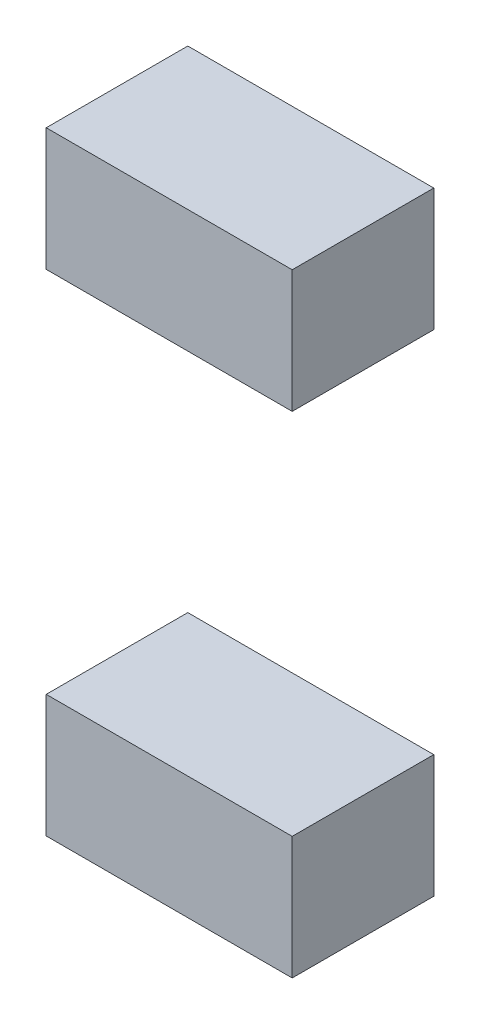
ISO-10303-21;
HEADER;
FILE_DESCRIPTION(('STEP AP214'),'2;1');
FILE_NAME('part.step','',(''),(''),'','','');
FILE_SCHEMA(('AUTOMOTIVE_DESIGN { 1 0 10303 214 1 1 1 1 }'));
ENDSEC;
DATA;
#1=APPLICATION_CONTEXT('core data for automotive mechanical design processes');
#2=APPLICATION_PROTOCOL_DEFINITION('international standard','automotive_design',2000,#1);
#3=PRODUCT_CONTEXT('',#1,'mechanical');
#4=PRODUCT('Part','Part','',(#3));
#5=PRODUCT_RELATED_PRODUCT_CATEGORY('part','',(#4));
#6=PRODUCT_DEFINITION_FORMATION('','',#4);
#7=PRODUCT_DEFINITION_CONTEXT('part definition',#1,'design');
#8=PRODUCT_DEFINITION('design','',#6,#7);
#9=PRODUCT_DEFINITION_SHAPE('','',#8);
#10=(LENGTH_UNIT() NAMED_UNIT(*) SI_UNIT(.MILLI.,.METRE.));
#11=(NAMED_UNIT(*) PLANE_ANGLE_UNIT() SI_UNIT($,.RADIAN.));
#12=(NAMED_UNIT(*) SI_UNIT($,.STERADIAN.) SOLID_ANGLE_UNIT());
#13=UNCERTAINTY_MEASURE_WITH_UNIT(LENGTH_MEASURE(1.E-05),#10,'distance_accuracy_value','');
#14=(GEOMETRIC_REPRESENTATION_CONTEXT(3) GLOBAL_UNCERTAINTY_ASSIGNED_CONTEXT((#13)) GLOBAL_UNIT_ASSIGNED_CONTEXT((#10,
#11,#12)) REPRESENTATION_CONTEXT('',''));
#15=CARTESIAN_POINT('',(0.,0.,0.));
#16=DIRECTION('',(0.,0.,1.));
#17=DIRECTION('',(1.,0.,0.));
#18=AXIS2_PLACEMENT_3D('',#15,#16,#17);
#19=CARTESIAN_POINT('',(-52.3811537271412,250.,-23.9398241643575));
#20=DIRECTION('',(1.,0.,0.));
#21=DIRECTION('',(0.,0.,-1.));
#22=AXIS2_PLACEMENT_3D('',#19,#20,#21);
#23=PLANE('',#22);
#24=DIRECTION('',(0.,0.,1.));
#25=VECTOR('',#24,1.);
#26=CARTESIAN_POINT('',(-52.3811537271412,200.,-23.9398241643575));
#27=LINE('',#26,#25);
#28=CARTESIAN_POINT('',(-52.3811537271412,200.,-23.9398241643575));
#29=VERTEX_POINT('',#28);
#30=CARTESIAN_POINT('',(-52.3811537271412,200.,33.7612904881965));
#31=VERTEX_POINT('',#30);
#32=EDGE_CURVE('E108',#29,#31,#27,.T.);
#33=ORIENTED_EDGE('',*,*,#32,.T.);
#34=DIRECTION('',(0.,-1.,0.));
#35=VECTOR('',#34,1.);
#36=CARTESIAN_POINT('',(-52.3811537271412,250.,33.7612904881965));
#37=LINE('',#36,#35);
#38=CARTESIAN_POINT('',(-52.3811537271412,250.,33.7612904881965));
#39=VERTEX_POINT('',#38);
#40=EDGE_CURVE('E12',#39,#31,#37,.T.);
#41=ORIENTED_EDGE('',*,*,#40,.F.);
#42=DIRECTION('',(0.,0.,1.));
#43=VECTOR('',#42,1.);
#44=CARTESIAN_POINT('',(-52.3811537271412,250.,-23.9398241643575));
#45=LINE('',#44,#43);
#46=CARTESIAN_POINT('',(-52.3811537271412,250.,-23.9398241643575));
#47=VERTEX_POINT('',#46);
#48=EDGE_CURVE('E96',#47,#39,#45,.T.);
#49=ORIENTED_EDGE('',*,*,#48,.F.);
#50=DIRECTION('',(0.,-1.,0.));
#51=VECTOR('',#50,1.);
#52=CARTESIAN_POINT('',(-52.3811537271412,250.,-23.9398241643575));
#53=LINE('',#52,#51);
#54=EDGE_CURVE('E104',#47,#29,#53,.T.);
#55=ORIENTED_EDGE('',*,*,#54,.T.);
#56=EDGE_LOOP('',(#33,#41,#49,#55));
#57=FACE_BOUND('',#56,.T.);
#58=ADVANCED_FACE('F45',(#57),#23,.F.);
#59=CARTESIAN_POINT('',(-52.3811537271412,250.,33.7612904881965));
#60=DIRECTION('',(0.,0.,-1.));
#61=DIRECTION('',(-1.,0.,0.));
#62=AXIS2_PLACEMENT_3D('',#59,#60,#61);
#63=PLANE('',#62);
#64=DIRECTION('',(1.,0.,0.));
#65=VECTOR('',#64,1.);
#66=CARTESIAN_POINT('',(-52.3811537271412,200.,33.7612904881965));
#67=LINE('',#66,#65);
#68=CARTESIAN_POINT('',(47.8796483287149,200.,33.7612904881965));
#69=VERTEX_POINT('',#68);
#70=EDGE_CURVE('E100',#31,#69,#67,.T.);
#71=ORIENTED_EDGE('',*,*,#70,.T.);
#72=DIRECTION('',(0.,-1.,0.));
#73=VECTOR('',#72,1.);
#74=CARTESIAN_POINT('',(47.8796483287149,250.,33.7612904881965));
#75=LINE('',#74,#73);
#76=CARTESIAN_POINT('',(47.8796483287149,250.,33.7612904881965));
#77=VERTEX_POINT('',#76);
#78=EDGE_CURVE('E53',#77,#69,#75,.T.);
#79=ORIENTED_EDGE('',*,*,#78,.F.);
#80=DIRECTION('',(1.,0.,0.));
#81=VECTOR('',#80,1.);
#82=CARTESIAN_POINT('',(-52.3811537271412,250.,33.7612904881965));
#83=LINE('',#82,#81);
#84=EDGE_CURVE('E91',#39,#77,#83,.T.);
#85=ORIENTED_EDGE('',*,*,#84,.F.);
#86=ORIENTED_EDGE('',*,*,#40,.T.);
#87=EDGE_LOOP('',(#71,#79,#85,#86));
#88=FACE_BOUND('',#87,.T.);
#89=ADVANCED_FACE('F99',(#88),#63,.F.);
#90=CARTESIAN_POINT('',(47.8796483287149,250.,-23.9398241643575));
#91=DIRECTION('',(-1.,0.,0.));
#92=DIRECTION('',(0.,0.,1.));
#93=AXIS2_PLACEMENT_3D('',#90,#91,#92);
#94=PLANE('',#93);
#95=DIRECTION('',(0.,0.,-1.));
#96=VECTOR('',#95,1.);
#97=CARTESIAN_POINT('',(47.8796483287149,200.,-23.9398241643575));
#98=LINE('',#97,#96);
#99=CARTESIAN_POINT('',(47.8796483287149,200.,-23.9398241643575));
#100=VERTEX_POINT('',#99);
#101=EDGE_CURVE('E78',#69,#100,#98,.T.);
#102=ORIENTED_EDGE('',*,*,#101,.T.);
#103=DIRECTION('',(0.,-1.,0.));
#104=VECTOR('',#103,1.);
#105=CARTESIAN_POINT('',(47.8796483287149,250.,-23.9398241643575));
#106=LINE('',#105,#104);
#107=CARTESIAN_POINT('',(47.8796483287149,250.,-23.9398241643575));
#108=VERTEX_POINT('',#107);
#109=EDGE_CURVE('E101',#108,#100,#106,.T.);
#110=ORIENTED_EDGE('',*,*,#109,.F.);
#111=DIRECTION('',(0.,0.,-1.));
#112=VECTOR('',#111,1.);
#113=CARTESIAN_POINT('',(47.8796483287149,250.,-23.9398241643575));
#114=LINE('',#113,#112);
#115=EDGE_CURVE('E94',#77,#108,#114,.T.);
#116=ORIENTED_EDGE('',*,*,#115,.F.);
#117=ORIENTED_EDGE('',*,*,#78,.T.);
#118=EDGE_LOOP('',(#102,#110,#116,#117));
#119=FACE_BOUND('',#118,.T.);
#120=ADVANCED_FACE('F102',(#119),#94,.F.);
#121=CARTESIAN_POINT('',(-52.3811537271412,250.,-23.9398241643575));
#122=DIRECTION('',(0.,0.,1.));
#123=DIRECTION('',(1.,0.,0.));
#124=AXIS2_PLACEMENT_3D('',#121,#122,#123);
#125=PLANE('',#124);
#126=DIRECTION('',(-1.,0.,0.));
#127=VECTOR('',#126,1.);
#128=CARTESIAN_POINT('',(-52.3811537271412,200.,-23.9398241643575));
#129=LINE('',#128,#127);
#130=EDGE_CURVE('E84',#100,#29,#129,.T.);
#131=ORIENTED_EDGE('',*,*,#130,.T.);
#132=ORIENTED_EDGE('',*,*,#54,.F.);
#133=DIRECTION('',(-1.,0.,0.));
#134=VECTOR('',#133,1.);
#135=CARTESIAN_POINT('',(-52.3811537271412,250.,-23.9398241643575));
#136=LINE('',#135,#134);
#137=EDGE_CURVE('E61',#108,#47,#136,.T.);
#138=ORIENTED_EDGE('',*,*,#137,.F.);
#139=ORIENTED_EDGE('',*,*,#109,.T.);
#140=EDGE_LOOP('',(#131,#132,#138,#139));
#141=FACE_BOUND('',#140,.T.);
#142=ADVANCED_FACE('F115',(#141),#125,.F.);
#143=CARTESIAN_POINT('',(0.,250.,0.));
#144=DIRECTION('',(0.,1.,0.));
#145=DIRECTION('',(0.,0.,1.));
#146=AXIS2_PLACEMENT_3D('',#143,#144,#145);
#147=PLANE('',#146);
#148=ORIENTED_EDGE('',*,*,#48,.T.);
#149=ORIENTED_EDGE('',*,*,#84,.T.);
#150=ORIENTED_EDGE('',*,*,#115,.T.);
#151=ORIENTED_EDGE('',*,*,#137,.T.);
#152=EDGE_LOOP('',(#148,#149,#150,#151));
#153=FACE_BOUND('',#152,.T.);
#154=ADVANCED_FACE('F92',(#153),#147,.T.);
#155=CARTESIAN_POINT('',(0.,200.,0.));
#156=DIRECTION('',(0.,1.,0.));
#157=DIRECTION('',(0.,0.,1.));
#158=AXIS2_PLACEMENT_3D('',#155,#156,#157);
#159=PLANE('',#158);
#160=ORIENTED_EDGE('',*,*,#32,.F.);
#161=ORIENTED_EDGE('',*,*,#130,.F.);
#162=ORIENTED_EDGE('',*,*,#101,.F.);
#163=ORIENTED_EDGE('',*,*,#70,.F.);
#164=EDGE_LOOP('',(#160,#161,#162,#163));
#165=FACE_BOUND('',#164,.T.);
#166=ADVANCED_FACE('F118',(#165),#159,.F.);
#167=CLOSED_SHELL('',(#58,#89,#120,#142,#154,#166));
#168=MANIFOLD_SOLID_BREP('B2',#167);
#169=CARTESIAN_POINT('',(-52.3811537271412,50.,-23.9398241643575));
#170=DIRECTION('',(1.,0.,0.));
#171=DIRECTION('',(0.,0.,-1.));
#172=AXIS2_PLACEMENT_3D('',#169,#170,#171);
#173=PLANE('',#172);
#174=DIRECTION('',(0.,0.,1.));
#175=VECTOR('',#174,1.);
#176=CARTESIAN_POINT('',(-52.3811537271412,0.,-23.9398241643575));
#177=LINE('',#176,#175);
#178=CARTESIAN_POINT('',(-52.3811537271412,0.,-23.9398241643575));
#179=VERTEX_POINT('',#178);
#180=CARTESIAN_POINT('',(-52.3811537271412,0.,33.7612904881965));
#181=VERTEX_POINT('',#180);
#182=EDGE_CURVE('E232',#179,#181,#177,.T.);
#183=ORIENTED_EDGE('',*,*,#182,.T.);
#184=DIRECTION('',(0.,-1.,0.));
#185=VECTOR('',#184,1.);
#186=CARTESIAN_POINT('',(-52.3811537271412,50.,33.7612904881965));
#187=LINE('',#186,#185);
#188=CARTESIAN_POINT('',(-52.3811537271412,50.,33.7612904881965));
#189=VERTEX_POINT('',#188);
#190=EDGE_CURVE('E43',#189,#181,#187,.T.);
#191=ORIENTED_EDGE('',*,*,#190,.F.);
#192=DIRECTION('',(0.,0.,1.));
#193=VECTOR('',#192,1.);
#194=CARTESIAN_POINT('',(-52.3811537271412,50.,-23.9398241643575));
#195=LINE('',#194,#193);
#196=CARTESIAN_POINT('',(-52.3811537271412,50.,-23.9398241643575));
#197=VERTEX_POINT('',#196);
#198=EDGE_CURVE('E220',#197,#189,#195,.T.);
#199=ORIENTED_EDGE('',*,*,#198,.F.);
#200=DIRECTION('',(0.,-1.,0.));
#201=VECTOR('',#200,1.);
#202=CARTESIAN_POINT('',(-52.3811537271412,50.,-23.9398241643575));
#203=LINE('',#202,#201);
#204=EDGE_CURVE('E228',#197,#179,#203,.T.);
#205=ORIENTED_EDGE('',*,*,#204,.T.);
#206=EDGE_LOOP('',(#183,#191,#199,#205));
#207=FACE_BOUND('',#206,.T.);
#208=ADVANCED_FACE('F169',(#207),#173,.F.);
#209=CARTESIAN_POINT('',(-52.3811537271412,50.,33.7612904881965));
#210=DIRECTION('',(0.,0.,-1.));
#211=DIRECTION('',(-1.,0.,0.));
#212=AXIS2_PLACEMENT_3D('',#209,#210,#211);
#213=PLANE('',#212);
#214=DIRECTION('',(1.,0.,0.));
#215=VECTOR('',#214,1.);
#216=CARTESIAN_POINT('',(-52.3811537271412,0.,33.7612904881965));
#217=LINE('',#216,#215);
#218=CARTESIAN_POINT('',(47.8796483287149,0.,33.7612904881965));
#219=VERTEX_POINT('',#218);
#220=EDGE_CURVE('E224',#181,#219,#217,.T.);
#221=ORIENTED_EDGE('',*,*,#220,.T.);
#222=DIRECTION('',(0.,-1.,0.));
#223=VECTOR('',#222,1.);
#224=CARTESIAN_POINT('',(47.8796483287149,50.,33.7612904881965));
#225=LINE('',#224,#223);
#226=CARTESIAN_POINT('',(47.8796483287149,50.,33.7612904881965));
#227=VERTEX_POINT('',#226);
#228=EDGE_CURVE('E177',#227,#219,#225,.T.);
#229=ORIENTED_EDGE('',*,*,#228,.F.);
#230=DIRECTION('',(1.,0.,0.));
#231=VECTOR('',#230,1.);
#232=CARTESIAN_POINT('',(-52.3811537271412,50.,33.7612904881965));
#233=LINE('',#232,#231);
#234=EDGE_CURVE('E215',#189,#227,#233,.T.);
#235=ORIENTED_EDGE('',*,*,#234,.F.);
#236=ORIENTED_EDGE('',*,*,#190,.T.);
#237=EDGE_LOOP('',(#221,#229,#235,#236));
#238=FACE_BOUND('',#237,.T.);
#239=ADVANCED_FACE('F223',(#238),#213,.F.);
#240=CARTESIAN_POINT('',(47.8796483287149,50.,-23.9398241643575));
#241=DIRECTION('',(-1.,0.,0.));
#242=DIRECTION('',(0.,0.,1.));
#243=AXIS2_PLACEMENT_3D('',#240,#241,#242);
#244=PLANE('',#243);
#245=DIRECTION('',(0.,0.,-1.));
#246=VECTOR('',#245,1.);
#247=CARTESIAN_POINT('',(47.8796483287149,0.,-23.9398241643575));
#248=LINE('',#247,#246);
#249=CARTESIAN_POINT('',(47.8796483287149,0.,-23.9398241643575));
#250=VERTEX_POINT('',#249);
#251=EDGE_CURVE('E202',#219,#250,#248,.T.);
#252=ORIENTED_EDGE('',*,*,#251,.T.);
#253=DIRECTION('',(0.,-1.,0.));
#254=VECTOR('',#253,1.);
#255=CARTESIAN_POINT('',(47.8796483287149,50.,-23.9398241643575));
#256=LINE('',#255,#254);
#257=CARTESIAN_POINT('',(47.8796483287149,50.,-23.9398241643575));
#258=VERTEX_POINT('',#257);
#259=EDGE_CURVE('E225',#258,#250,#256,.T.);
#260=ORIENTED_EDGE('',*,*,#259,.F.);
#261=DIRECTION('',(0.,0.,-1.));
#262=VECTOR('',#261,1.);
#263=CARTESIAN_POINT('',(47.8796483287149,50.,-23.9398241643575));
#264=LINE('',#263,#262);
#265=EDGE_CURVE('E218',#227,#258,#264,.T.);
#266=ORIENTED_EDGE('',*,*,#265,.F.);
#267=ORIENTED_EDGE('',*,*,#228,.T.);
#268=EDGE_LOOP('',(#252,#260,#266,#267));
#269=FACE_BOUND('',#268,.T.);
#270=ADVANCED_FACE('F226',(#269),#244,.F.);
#271=CARTESIAN_POINT('',(-52.3811537271412,50.,-23.9398241643575));
#272=DIRECTION('',(0.,0.,1.));
#273=DIRECTION('',(1.,0.,0.));
#274=AXIS2_PLACEMENT_3D('',#271,#272,#273);
#275=PLANE('',#274);
#276=DIRECTION('',(-1.,0.,0.));
#277=VECTOR('',#276,1.);
#278=CARTESIAN_POINT('',(-52.3811537271412,0.,-23.9398241643575));
#279=LINE('',#278,#277);
#280=EDGE_CURVE('E208',#250,#179,#279,.T.);
#281=ORIENTED_EDGE('',*,*,#280,.T.);
#282=ORIENTED_EDGE('',*,*,#204,.F.);
#283=DIRECTION('',(-1.,0.,0.));
#284=VECTOR('',#283,1.);
#285=CARTESIAN_POINT('',(-52.3811537271412,50.,-23.9398241643575));
#286=LINE('',#285,#284);
#287=EDGE_CURVE('E185',#258,#197,#286,.T.);
#288=ORIENTED_EDGE('',*,*,#287,.F.);
#289=ORIENTED_EDGE('',*,*,#259,.T.);
#290=EDGE_LOOP('',(#281,#282,#288,#289));
#291=FACE_BOUND('',#290,.T.);
#292=ADVANCED_FACE('F239',(#291),#275,.F.);
#293=CARTESIAN_POINT('',(0.,50.,0.));
#294=DIRECTION('',(0.,1.,0.));
#295=DIRECTION('',(0.,0.,1.));
#296=AXIS2_PLACEMENT_3D('',#293,#294,#295);
#297=PLANE('',#296);
#298=ORIENTED_EDGE('',*,*,#198,.T.);
#299=ORIENTED_EDGE('',*,*,#234,.T.);
#300=ORIENTED_EDGE('',*,*,#265,.T.);
#301=ORIENTED_EDGE('',*,*,#287,.T.);
#302=EDGE_LOOP('',(#298,#299,#300,#301));
#303=FACE_BOUND('',#302,.T.);
#304=ADVANCED_FACE('F216',(#303),#297,.T.);
#305=CARTESIAN_POINT('',(0.,0.,0.));
#306=DIRECTION('',(0.,1.,0.));
#307=DIRECTION('',(0.,0.,1.));
#308=AXIS2_PLACEMENT_3D('',#305,#306,#307);
#309=PLANE('',#308);
#310=ORIENTED_EDGE('',*,*,#182,.F.);
#311=ORIENTED_EDGE('',*,*,#280,.F.);
#312=ORIENTED_EDGE('',*,*,#251,.F.);
#313=ORIENTED_EDGE('',*,*,#220,.F.);
#314=EDGE_LOOP('',(#310,#311,#312,#313));
#315=FACE_BOUND('',#314,.T.);
#316=ADVANCED_FACE('F242',(#315),#309,.F.);
#317=CLOSED_SHELL('',(#208,#239,#270,#292,#304,#316));
#318=MANIFOLD_SOLID_BREP('B6',#317);
#319=ADVANCED_BREP_SHAPE_REPRESENTATION('',(#18,#168,#318),#14);
#320=SHAPE_DEFINITION_REPRESENTATION(#9,#319);
ENDSEC;
END-ISO-10303-21;
